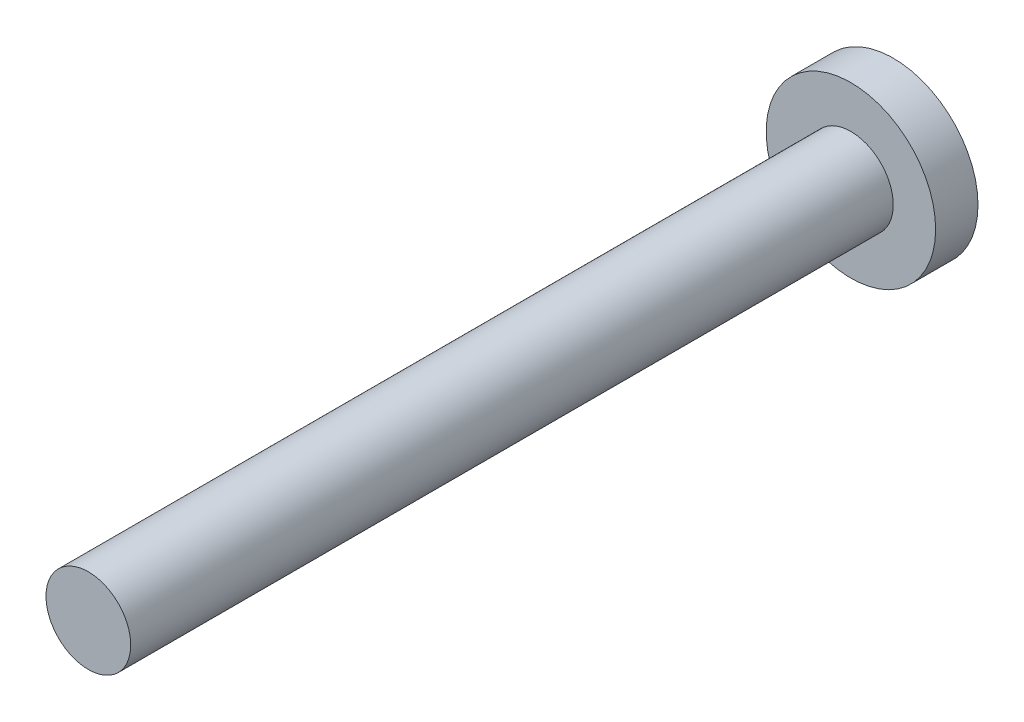
ISO-10303-21;
HEADER;
FILE_DESCRIPTION(('STEP AP214'),'2;1');
FILE_NAME('part.step','',(''),(''),'','','');
FILE_SCHEMA(('AUTOMOTIVE_DESIGN { 1 0 10303 214 1 1 1 1 }'));
ENDSEC;
DATA;
#1=APPLICATION_CONTEXT('core data for automotive mechanical design processes');
#2=APPLICATION_PROTOCOL_DEFINITION('international standard','automotive_design',2000,#1);
#3=PRODUCT_CONTEXT('',#1,'mechanical');
#4=PRODUCT('Part','Part','',(#3));
#5=PRODUCT_RELATED_PRODUCT_CATEGORY('part','',(#4));
#6=PRODUCT_DEFINITION_FORMATION('','',#4);
#7=PRODUCT_DEFINITION_CONTEXT('part definition',#1,'design');
#8=PRODUCT_DEFINITION('design','',#6,#7);
#9=PRODUCT_DEFINITION_SHAPE('','',#8);
#10=(LENGTH_UNIT() NAMED_UNIT(*) SI_UNIT(.MILLI.,.METRE.));
#11=(NAMED_UNIT(*) PLANE_ANGLE_UNIT() SI_UNIT($,.RADIAN.));
#12=(NAMED_UNIT(*) SI_UNIT($,.STERADIAN.) SOLID_ANGLE_UNIT());
#13=UNCERTAINTY_MEASURE_WITH_UNIT(LENGTH_MEASURE(1.E-05),#10,'distance_accuracy_value','');
#14=(GEOMETRIC_REPRESENTATION_CONTEXT(3) GLOBAL_UNCERTAINTY_ASSIGNED_CONTEXT((#13)) GLOBAL_UNIT_ASSIGNED_CONTEXT((#10,
#11,#12)) REPRESENTATION_CONTEXT('',''));
#15=CARTESIAN_POINT('',(0.,0.,0.));
#16=DIRECTION('',(0.,0.,1.));
#17=DIRECTION('',(1.,0.,0.));
#18=AXIS2_PLACEMENT_3D('',#15,#16,#17);
#19=CARTESIAN_POINT('',(0.,0.,5.));
#20=DIRECTION('',(0.,0.,-1.));
#21=DIRECTION('',(-1.,0.,0.));
#22=AXIS2_PLACEMENT_3D('',#19,#20,#21);
#23=CYLINDRICAL_SURFACE('',#22,10.);
#24=CARTESIAN_POINT('',(0.,0.,5.));
#25=DIRECTION('',(0.,0.,1.));
#26=DIRECTION('',(1.,0.,0.));
#27=AXIS2_PLACEMENT_3D('',#24,#25,#26);
#28=CIRCLE('',#27,10.);
#29=CARTESIAN_POINT('',(10.,0.,5.));
#30=VERTEX_POINT('',#29);
#31=EDGE_CURVE('E45',#30,#30,#28,.T.);
#32=ORIENTED_EDGE('',*,*,#31,.F.);
#33=EDGE_LOOP('',(#32));
#34=FACE_BOUND('',#33,.T.);
#35=CARTESIAN_POINT('',(0.,0.,0.));
#36=DIRECTION('',(0.,0.,1.));
#37=DIRECTION('',(1.,0.,0.));
#38=AXIS2_PLACEMENT_3D('',#35,#36,#37);
#39=CIRCLE('',#38,10.);
#40=CARTESIAN_POINT('',(10.,0.,0.));
#41=VERTEX_POINT('',#40);
#42=EDGE_CURVE('E40',#41,#41,#39,.T.);
#43=ORIENTED_EDGE('',*,*,#42,.T.);
#44=EDGE_LOOP('',(#43));
#45=FACE_BOUND('',#44,.T.);
#46=ADVANCED_FACE('F37',(#34,#45),#23,.T.);
#47=CARTESIAN_POINT('',(0.,0.,5.));
#48=DIRECTION('',(0.,0.,1.));
#49=DIRECTION('',(1.,0.,0.));
#50=AXIS2_PLACEMENT_3D('',#47,#48,#49);
#51=PLANE('',#50);
#52=CARTESIAN_POINT('',(0.,0.,5.));
#53=DIRECTION('',(0.,0.,1.));
#54=DIRECTION('',(1.,0.,0.));
#55=AXIS2_PLACEMENT_3D('',#52,#53,#54);
#56=CIRCLE('',#55,5.);
#57=CARTESIAN_POINT('',(-5.,0.,4.99999999999999));
#58=VERTEX_POINT('',#57);
#59=EDGE_CURVE('E10',#58,#58,#56,.T.);
#60=ORIENTED_EDGE('',*,*,#59,.F.);
#61=EDGE_LOOP('',(#60));
#62=FACE_BOUND('',#61,.T.);
#63=ORIENTED_EDGE('',*,*,#31,.T.);
#64=EDGE_LOOP('',(#63));
#65=FACE_BOUND('',#64,.T.);
#66=ADVANCED_FACE('F65',(#62,#65),#51,.T.);
#67=CARTESIAN_POINT('',(0.,0.,0.));
#68=DIRECTION('',(0.,0.,1.));
#69=DIRECTION('',(1.,0.,0.));
#70=AXIS2_PLACEMENT_3D('',#67,#68,#69);
#71=PLANE('',#70);
#72=ORIENTED_EDGE('',*,*,#42,.F.);
#73=EDGE_LOOP('',(#72));
#74=FACE_BOUND('',#73,.T.);
#75=ADVANCED_FACE('F62',(#74),#71,.F.);
#76=CARTESIAN_POINT('',(0.,0.,95.));
#77=DIRECTION('',(0.,0.,-1.));
#78=DIRECTION('',(-1.,0.,0.));
#79=AXIS2_PLACEMENT_3D('',#76,#77,#78);
#80=CYLINDRICAL_SURFACE('',#79,5.);
#81=CARTESIAN_POINT('',(0.,0.,95.));
#82=DIRECTION('',(0.,0.,1.));
#83=DIRECTION('',(1.,0.,0.));
#84=AXIS2_PLACEMENT_3D('',#81,#82,#83);
#85=CIRCLE('',#84,5.);
#86=CARTESIAN_POINT('',(-5.,0.,95.));
#87=VERTEX_POINT('',#86);
#88=EDGE_CURVE('E52',#87,#87,#85,.T.);
#89=CARTESIAN_POINT('',(-5.,0.,95.));
#90=CARTESIAN_POINT('',(-5.,0.,94.0625));
#91=CARTESIAN_POINT('',(-5.,0.,93.125));
#92=CARTESIAN_POINT('',(-5.,0.,91.25));
#93=CARTESIAN_POINT('',(-5.,0.,90.3125));
#94=CARTESIAN_POINT('',(-5.,0.,88.4375));
#95=CARTESIAN_POINT('',(-5.,0.,87.5));
#96=CARTESIAN_POINT('',(-5.,0.,85.625));
#97=CARTESIAN_POINT('',(-5.,0.,84.6875));
#98=CARTESIAN_POINT('',(-5.,0.,82.8125));
#99=CARTESIAN_POINT('',(-5.,0.,81.875));
#100=CARTESIAN_POINT('',(-5.,0.,80.));
#101=CARTESIAN_POINT('',(-5.,0.,79.0625));
#102=CARTESIAN_POINT('',(-5.,0.,77.1875));
#103=CARTESIAN_POINT('',(-5.,0.,76.25));
#104=CARTESIAN_POINT('',(-5.,0.,74.375));
#105=CARTESIAN_POINT('',(-5.,0.,73.4375));
#106=CARTESIAN_POINT('',(-5.,0.,71.5625));
#107=CARTESIAN_POINT('',(-5.,0.,70.625));
#108=CARTESIAN_POINT('',(-5.,0.,68.75));
#109=CARTESIAN_POINT('',(-5.,0.,67.8125));
#110=CARTESIAN_POINT('',(-5.,0.,65.9375));
#111=CARTESIAN_POINT('',(-5.,0.,65.));
#112=CARTESIAN_POINT('',(-5.,0.,63.125));
#113=CARTESIAN_POINT('',(-5.,0.,62.1875));
#114=CARTESIAN_POINT('',(-5.,0.,60.3125));
#115=CARTESIAN_POINT('',(-5.,0.,59.375));
#116=CARTESIAN_POINT('',(-5.,0.,57.5));
#117=CARTESIAN_POINT('',(-5.,0.,56.5625));
#118=CARTESIAN_POINT('',(-5.,0.,54.6875));
#119=CARTESIAN_POINT('',(-5.,0.,53.75));
#120=CARTESIAN_POINT('',(-5.,0.,51.875));
#121=CARTESIAN_POINT('',(-5.,0.,50.9375));
#122=CARTESIAN_POINT('',(-5.,0.,49.0625));
#123=CARTESIAN_POINT('',(-5.,0.,48.125));
#124=CARTESIAN_POINT('',(-5.,0.,46.25));
#125=CARTESIAN_POINT('',(-5.,0.,45.3125));
#126=CARTESIAN_POINT('',(-5.,0.,43.4375));
#127=CARTESIAN_POINT('',(-5.,0.,42.5));
#128=CARTESIAN_POINT('',(-5.,0.,40.625));
#129=CARTESIAN_POINT('',(-5.,0.,39.6875));
#130=CARTESIAN_POINT('',(-5.,0.,37.8125));
#131=CARTESIAN_POINT('',(-5.,0.,36.875));
#132=CARTESIAN_POINT('',(-5.,0.,35.));
#133=CARTESIAN_POINT('',(-5.,0.,34.0625));
#134=CARTESIAN_POINT('',(-5.,0.,32.1875));
#135=CARTESIAN_POINT('',(-5.,0.,31.25));
#136=CARTESIAN_POINT('',(-5.,0.,29.375));
#137=CARTESIAN_POINT('',(-5.,0.,28.4375));
#138=CARTESIAN_POINT('',(-5.,0.,26.5625));
#139=CARTESIAN_POINT('',(-5.,0.,25.625));
#140=CARTESIAN_POINT('',(-5.,0.,23.75));
#141=CARTESIAN_POINT('',(-5.,0.,22.8125));
#142=CARTESIAN_POINT('',(-5.,0.,20.9375));
#143=CARTESIAN_POINT('',(-5.,0.,20.));
#144=CARTESIAN_POINT('',(-5.,0.,18.125));
#145=CARTESIAN_POINT('',(-5.,0.,17.1875));
#146=CARTESIAN_POINT('',(-5.,0.,15.3125));
#147=CARTESIAN_POINT('',(-5.,0.,14.375));
#148=CARTESIAN_POINT('',(-5.,0.,12.5));
#149=CARTESIAN_POINT('',(-5.,0.,11.5625));
#150=CARTESIAN_POINT('',(-5.,0.,9.68749999999999));
#151=CARTESIAN_POINT('',(-5.,0.,8.74999999999999));
#152=CARTESIAN_POINT('',(-5.,0.,6.87499999999999));
#153=CARTESIAN_POINT('',(-5.,0.,5.93749999999999));
#154=CARTESIAN_POINT('',(-5.,0.,4.99999999999999));
#155=B_SPLINE_CURVE_WITH_KNOTS('',3,(#89,#90,#91,#92,#93,#94,#95,#96,#97,#98,#99,#100,#101,#102,
#103,#104,#105,#106,#107,#108,#109,#110,#111,#112,#113,#114,#115,#116,#117,#118,#119,#120,#121,
#122,#123,#124,#125,#126,#127,#128,#129,#130,#131,#132,#133,#134,#135,#136,#137,#138,#139,#140,
#141,#142,#143,#144,#145,#146,#147,#148,#149,#150,#151,#152,#153,#154),.UNSPECIFIED.,.F.,.F.,(4,
2,2,2,2,2,2,2,2,2,2,2,2,2,2,2,2,2,2,2,2,2,2,2,2,2,2,2,2,2,2,2,4),(0.,2.8125,5.62499999999999,
8.43749999999999,11.25,14.0625,16.875,19.6875,22.5,25.3125,28.125,30.9375,33.75,36.5625,39.375,
42.1875,45.,47.8125,50.625,53.4375,56.25,59.0625,61.875,64.6875,67.5,70.3125,73.125,75.9375,
78.75,81.5625,84.375,87.1875,90.),.UNSPECIFIED.);
#156=EDGE_CURVE('BSEAM64',#87,#58,#155,.T.);
#157=ORIENTED_EDGE('',*,*,#88,.F.);
#158=ORIENTED_EDGE('',*,*,#59,.T.);
#159=ORIENTED_EDGE('',*,*,#156,.T.);
#160=ORIENTED_EDGE('',*,*,#156,.F.);
#161=EDGE_LOOP('',(#157,#159,#158,#160));
#162=FACE_BOUND('',#161,.T.);
#163=ADVANCED_FACE('F64',(#162),#80,.T.);
#164=CARTESIAN_POINT('',(0.,0.,95.));
#165=DIRECTION('',(0.,0.,1.));
#166=DIRECTION('',(1.,0.,0.));
#167=AXIS2_PLACEMENT_3D('',#164,#165,#166);
#168=PLANE('',#167);
#169=ORIENTED_EDGE('',*,*,#88,.T.);
#170=EDGE_LOOP('',(#169));
#171=FACE_BOUND('',#170,.T.);
#172=ADVANCED_FACE('F70',(#171),#168,.T.);
#173=CLOSED_SHELL('',(#46,#66,#75,#163,#172));
#174=MANIFOLD_SOLID_BREP('B2',#173);
#175=ADVANCED_BREP_SHAPE_REPRESENTATION('',(#18,#174),#14);
#176=SHAPE_DEFINITION_REPRESENTATION(#9,#175);
ENDSEC;
END-ISO-10303-21;
